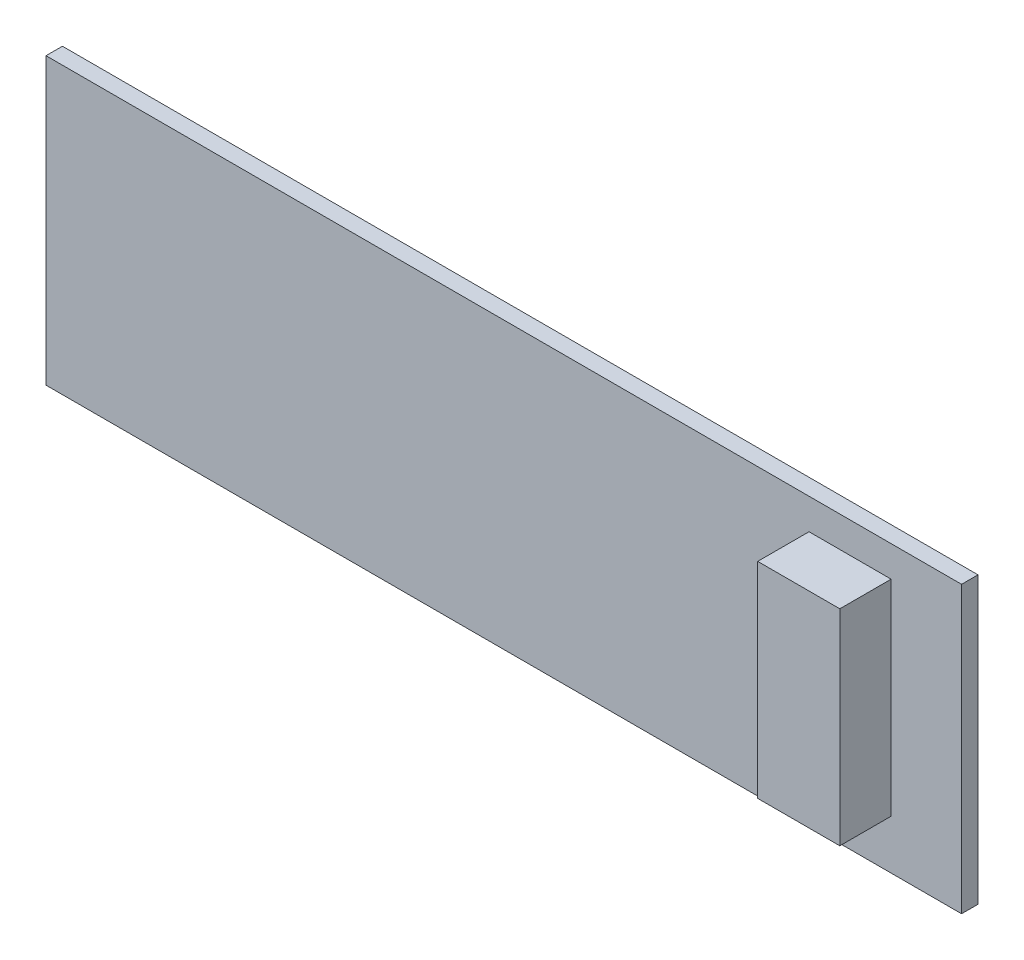
ISO-10303-21;
HEADER;
FILE_DESCRIPTION(('STEP AP214'),'2;1');
FILE_NAME('part.step','',(''),(''),'','','');
FILE_SCHEMA(('AUTOMOTIVE_DESIGN { 1 0 10303 214 1 1 1 1 }'));
ENDSEC;
DATA;
#1=APPLICATION_CONTEXT('core data for automotive mechanical design processes');
#2=APPLICATION_PROTOCOL_DEFINITION('international standard','automotive_design',2000,#1);
#3=PRODUCT_CONTEXT('',#1,'mechanical');
#4=PRODUCT('Part','Part','',(#3));
#5=PRODUCT_RELATED_PRODUCT_CATEGORY('part','',(#4));
#6=PRODUCT_DEFINITION_FORMATION('','',#4);
#7=PRODUCT_DEFINITION_CONTEXT('part definition',#1,'design');
#8=PRODUCT_DEFINITION('design','',#6,#7);
#9=PRODUCT_DEFINITION_SHAPE('','',#8);
#10=(LENGTH_UNIT() NAMED_UNIT(*) SI_UNIT(.MILLI.,.METRE.));
#11=(NAMED_UNIT(*) PLANE_ANGLE_UNIT() SI_UNIT($,.RADIAN.));
#12=(NAMED_UNIT(*) SI_UNIT($,.STERADIAN.) SOLID_ANGLE_UNIT());
#13=UNCERTAINTY_MEASURE_WITH_UNIT(LENGTH_MEASURE(1.E-05),#10,'distance_accuracy_value','');
#14=(GEOMETRIC_REPRESENTATION_CONTEXT(3) GLOBAL_UNCERTAINTY_ASSIGNED_CONTEXT((#13)) GLOBAL_UNIT_ASSIGNED_CONTEXT((#10,
#11,#12)) REPRESENTATION_CONTEXT('',''));
#15=CARTESIAN_POINT('',(0.,0.,0.));
#16=DIRECTION('',(0.,0.,1.));
#17=DIRECTION('',(1.,0.,0.));
#18=AXIS2_PLACEMENT_3D('',#15,#16,#17);
#19=CARTESIAN_POINT('',(0.,0.,0.));
#20=DIRECTION('',(0.,0.,1.));
#21=DIRECTION('',(1.,0.,0.));
#22=AXIS2_PLACEMENT_3D('',#19,#20,#21);
#23=PLANE('',#22);
#24=DIRECTION('',(0.,-1.,0.));
#25=VECTOR('',#24,1.);
#26=CARTESIAN_POINT('',(-44.6,13.9,0.));
#27=LINE('',#26,#25);
#28=CARTESIAN_POINT('',(-44.6,13.9,0.));
#29=VERTEX_POINT('',#28);
#30=CARTESIAN_POINT('',(-44.6,-13.9,0.));
#31=VERTEX_POINT('',#30);
#32=EDGE_CURVE('E133',#29,#31,#27,.T.);
#33=ORIENTED_EDGE('',*,*,#32,.T.);
#34=DIRECTION('',(1.,0.,0.));
#35=VECTOR('',#34,1.);
#36=CARTESIAN_POINT('',(-44.6,-13.9,0.));
#37=LINE('',#36,#35);
#38=CARTESIAN_POINT('',(44.6,-13.9,0.));
#39=VERTEX_POINT('',#38);
#40=EDGE_CURVE('E136',#31,#39,#37,.T.);
#41=ORIENTED_EDGE('',*,*,#40,.T.);
#42=DIRECTION('',(0.,1.,0.));
#43=VECTOR('',#42,1.);
#44=CARTESIAN_POINT('',(44.6,-13.9,0.));
#45=LINE('',#44,#43);
#46=CARTESIAN_POINT('',(44.6,13.9,0.));
#47=VERTEX_POINT('',#46);
#48=EDGE_CURVE('E153',#39,#47,#45,.T.);
#49=ORIENTED_EDGE('',*,*,#48,.T.);
#50=DIRECTION('',(-1.,0.,0.));
#51=VECTOR('',#50,1.);
#52=CARTESIAN_POINT('',(44.6,13.9,0.));
#53=LINE('',#52,#51);
#54=EDGE_CURVE('E144',#47,#29,#53,.T.);
#55=ORIENTED_EDGE('',*,*,#54,.T.);
#56=EDGE_LOOP('',(#33,#41,#49,#55));
#57=FACE_BOUND('',#56,.T.);
#58=DIRECTION('',(-1.,0.,0.));
#59=VECTOR('',#58,1.);
#60=CARTESIAN_POINT('',(29.7376156955747,10.9031580087813,0.));
#61=LINE('',#60,#59);
#62=CARTESIAN_POINT('',(37.7376156955747,10.9031580087813,0.));
#63=VERTEX_POINT('',#62);
#64=CARTESIAN_POINT('',(29.7376156955747,10.9031580087813,0.));
#65=VERTEX_POINT('',#64);
#66=EDGE_CURVE('E265',#63,#65,#61,.T.);
#67=ORIENTED_EDGE('',*,*,#66,.F.);
#68=DIRECTION('',(0.,1.,0.));
#69=VECTOR('',#68,1.);
#70=CARTESIAN_POINT('',(37.7376156955747,10.9031580087813,0.));
#71=LINE('',#70,#69);
#72=CARTESIAN_POINT('',(37.7376156955747,-9.09684199121867,0.));
#73=VERTEX_POINT('',#72);
#74=EDGE_CURVE('E131',#73,#63,#71,.T.);
#75=ORIENTED_EDGE('',*,*,#74,.F.);
#76=DIRECTION('',(1.,0.,0.));
#77=VECTOR('',#76,1.);
#78=CARTESIAN_POINT('',(37.7376156955747,-9.09684199121867,0.));
#79=LINE('',#78,#77);
#80=CARTESIAN_POINT('',(29.7376156955747,-9.09684199121867,0.));
#81=VERTEX_POINT('',#80);
#82=EDGE_CURVE('E127',#81,#73,#79,.T.);
#83=ORIENTED_EDGE('',*,*,#82,.F.);
#84=DIRECTION('',(0.,-1.,0.));
#85=VECTOR('',#84,1.);
#86=CARTESIAN_POINT('',(29.7376156955747,-9.09684199121867,0.));
#87=LINE('',#86,#85);
#88=EDGE_CURVE('E262',#65,#81,#87,.T.);
#89=ORIENTED_EDGE('',*,*,#88,.F.);
#90=EDGE_LOOP('',(#67,#75,#83,#89));
#91=FACE_BOUND('',#90,.T.);
#92=ADVANCED_FACE('F35',(#57,#91),#23,.T.);
#93=CARTESIAN_POINT('',(-44.6,13.9,-1.6));
#94=DIRECTION('',(-1.,0.,0.));
#95=DIRECTION('',(0.,0.,1.));
#96=AXIS2_PLACEMENT_3D('',#93,#94,#95);
#97=PLANE('',#96);
#98=ORIENTED_EDGE('',*,*,#32,.F.);
#99=DIRECTION('',(0.,0.,1.));
#100=VECTOR('',#99,1.);
#101=CARTESIAN_POINT('',(-44.6,13.9,-1.6));
#102=LINE('',#101,#100);
#103=CARTESIAN_POINT('',(-44.6,13.9,-1.6));
#104=VERTEX_POINT('',#103);
#105=EDGE_CURVE('E11',#104,#29,#102,.T.);
#106=ORIENTED_EDGE('',*,*,#105,.F.);
#107=DIRECTION('',(0.,-1.,0.));
#108=VECTOR('',#107,1.);
#109=CARTESIAN_POINT('',(-44.6,13.9,-1.6));
#110=LINE('',#109,#108);
#111=CARTESIAN_POINT('',(-44.6,-13.9,-1.6));
#112=VERTEX_POINT('',#111);
#113=EDGE_CURVE('E141',#104,#112,#110,.T.);
#114=ORIENTED_EDGE('',*,*,#113,.T.);
#115=DIRECTION('',(0.,0.,1.));
#116=VECTOR('',#115,1.);
#117=CARTESIAN_POINT('',(-44.6,-13.9,-1.6));
#118=LINE('',#117,#116);
#119=EDGE_CURVE('E39',#112,#31,#118,.T.);
#120=ORIENTED_EDGE('',*,*,#119,.T.);
#121=EDGE_LOOP('',(#98,#106,#114,#120));
#122=FACE_BOUND('',#121,.T.);
#123=ADVANCED_FACE('F37',(#122),#97,.T.);
#124=CARTESIAN_POINT('',(44.6,13.9,-1.6));
#125=DIRECTION('',(0.,1.,0.));
#126=DIRECTION('',(0.,0.,1.));
#127=AXIS2_PLACEMENT_3D('',#124,#125,#126);
#128=PLANE('',#127);
#129=ORIENTED_EDGE('',*,*,#54,.F.);
#130=DIRECTION('',(0.,0.,1.));
#131=VECTOR('',#130,1.);
#132=CARTESIAN_POINT('',(44.6,13.9,-1.6));
#133=LINE('',#132,#131);
#134=CARTESIAN_POINT('',(44.6,13.9,-1.6));
#135=VERTEX_POINT('',#134);
#136=EDGE_CURVE('E44',#135,#47,#133,.T.);
#137=ORIENTED_EDGE('',*,*,#136,.F.);
#138=DIRECTION('',(-1.,0.,0.));
#139=VECTOR('',#138,1.);
#140=CARTESIAN_POINT('',(44.6,13.9,-1.6));
#141=LINE('',#140,#139);
#142=EDGE_CURVE('E149',#135,#104,#141,.T.);
#143=ORIENTED_EDGE('',*,*,#142,.T.);
#144=ORIENTED_EDGE('',*,*,#105,.T.);
#145=EDGE_LOOP('',(#129,#137,#143,#144));
#146=FACE_BOUND('',#145,.T.);
#147=ADVANCED_FACE('F163',(#146),#128,.T.);
#148=CARTESIAN_POINT('',(44.6,-13.9,-1.6));
#149=DIRECTION('',(1.,0.,0.));
#150=DIRECTION('',(0.,0.,-1.));
#151=AXIS2_PLACEMENT_3D('',#148,#149,#150);
#152=PLANE('',#151);
#153=ORIENTED_EDGE('',*,*,#48,.F.);
#154=DIRECTION('',(0.,0.,1.));
#155=VECTOR('',#154,1.);
#156=CARTESIAN_POINT('',(44.6,-13.9,-1.6));
#157=LINE('',#156,#155);
#158=CARTESIAN_POINT('',(44.6,-13.9,-1.6));
#159=VERTEX_POINT('',#158);
#160=EDGE_CURVE('E158',#159,#39,#157,.T.);
#161=ORIENTED_EDGE('',*,*,#160,.F.);
#162=DIRECTION('',(0.,1.,0.));
#163=VECTOR('',#162,1.);
#164=CARTESIAN_POINT('',(44.6,-13.9,-1.6));
#165=LINE('',#164,#163);
#166=EDGE_CURVE('E146',#159,#135,#165,.T.);
#167=ORIENTED_EDGE('',*,*,#166,.T.);
#168=ORIENTED_EDGE('',*,*,#136,.T.);
#169=EDGE_LOOP('',(#153,#161,#167,#168));
#170=FACE_BOUND('',#169,.T.);
#171=ADVANCED_FACE('F167',(#170),#152,.T.);
#172=CARTESIAN_POINT('',(-44.6,-13.9,-1.6));
#173=DIRECTION('',(0.,-1.,0.));
#174=DIRECTION('',(0.,0.,-1.));
#175=AXIS2_PLACEMENT_3D('',#172,#173,#174);
#176=PLANE('',#175);
#177=ORIENTED_EDGE('',*,*,#40,.F.);
#178=ORIENTED_EDGE('',*,*,#119,.F.);
#179=DIRECTION('',(1.,0.,0.));
#180=VECTOR('',#179,1.);
#181=CARTESIAN_POINT('',(-44.6,-13.9,-1.6));
#182=LINE('',#181,#180);
#183=EDGE_CURVE('E143',#112,#159,#182,.T.);
#184=ORIENTED_EDGE('',*,*,#183,.T.);
#185=ORIENTED_EDGE('',*,*,#160,.T.);
#186=EDGE_LOOP('',(#177,#178,#184,#185));
#187=FACE_BOUND('',#186,.T.);
#188=ADVANCED_FACE('F160',(#187),#176,.T.);
#189=CARTESIAN_POINT('',(0.,0.,-1.6));
#190=DIRECTION('',(0.,0.,1.));
#191=DIRECTION('',(1.,0.,0.));
#192=AXIS2_PLACEMENT_3D('',#189,#190,#191);
#193=PLANE('',#192);
#194=ORIENTED_EDGE('',*,*,#113,.F.);
#195=ORIENTED_EDGE('',*,*,#142,.F.);
#196=ORIENTED_EDGE('',*,*,#166,.F.);
#197=ORIENTED_EDGE('',*,*,#183,.F.);
#198=EDGE_LOOP('',(#194,#195,#196,#197));
#199=FACE_BOUND('',#198,.T.);
#200=ADVANCED_FACE('F169',(#199),#193,.F.);
#201=CARTESIAN_POINT('',(37.7376156955747,10.9031580087813,5.));
#202=DIRECTION('',(-1.,0.,0.));
#203=DIRECTION('',(0.,0.,1.));
#204=AXIS2_PLACEMENT_3D('',#201,#202,#203);
#205=PLANE('',#204);
#206=ORIENTED_EDGE('',*,*,#74,.T.);
#207=DIRECTION('',(0.,0.,-1.));
#208=VECTOR('',#207,1.);
#209=CARTESIAN_POINT('',(37.7376156955747,10.9031580087813,5.));
#210=LINE('',#209,#208);
#211=CARTESIAN_POINT('',(37.7376156955747,10.9031580087813,5.));
#212=VERTEX_POINT('',#211);
#213=EDGE_CURVE('E112',#212,#63,#210,.T.);
#214=ORIENTED_EDGE('',*,*,#213,.F.);
#215=DIRECTION('',(0.,1.,0.));
#216=VECTOR('',#215,1.);
#217=CARTESIAN_POINT('',(37.7376156955747,10.9031580087813,5.));
#218=LINE('',#217,#216);
#219=CARTESIAN_POINT('',(37.7376156955747,-9.09684199121867,5.));
#220=VERTEX_POINT('',#219);
#221=EDGE_CURVE('E119',#220,#212,#218,.T.);
#222=ORIENTED_EDGE('',*,*,#221,.F.);
#223=DIRECTION('',(0.,0.,-1.));
#224=VECTOR('',#223,1.);
#225=CARTESIAN_POINT('',(37.7376156955747,-9.09684199121867,5.));
#226=LINE('',#225,#224);
#227=EDGE_CURVE('E260',#220,#73,#226,.T.);
#228=ORIENTED_EDGE('',*,*,#227,.T.);
#229=EDGE_LOOP('',(#206,#214,#222,#228));
#230=FACE_BOUND('',#229,.T.);
#231=ADVANCED_FACE('F129',(#230),#205,.F.);
#232=CARTESIAN_POINT('',(29.7376156955747,10.9031580087813,5.));
#233=DIRECTION('',(0.,-1.,0.));
#234=DIRECTION('',(1.,0.,0.));
#235=AXIS2_PLACEMENT_3D('',#232,#233,#234);
#236=PLANE('',#235);
#237=ORIENTED_EDGE('',*,*,#66,.T.);
#238=DIRECTION('',(0.,0.,-1.));
#239=VECTOR('',#238,1.);
#240=CARTESIAN_POINT('',(29.7376156955747,10.9031580087813,5.));
#241=LINE('',#240,#239);
#242=CARTESIAN_POINT('',(29.7376156955747,10.9031580087813,5.));
#243=VERTEX_POINT('',#242);
#244=EDGE_CURVE('E115',#243,#65,#241,.T.);
#245=ORIENTED_EDGE('',*,*,#244,.F.);
#246=DIRECTION('',(-1.,0.,0.));
#247=VECTOR('',#246,1.);
#248=CARTESIAN_POINT('',(29.7376156955747,10.9031580087813,5.));
#249=LINE('',#248,#247);
#250=EDGE_CURVE('E108',#212,#243,#249,.T.);
#251=ORIENTED_EDGE('',*,*,#250,.F.);
#252=ORIENTED_EDGE('',*,*,#213,.T.);
#253=EDGE_LOOP('',(#237,#245,#251,#252));
#254=FACE_BOUND('',#253,.T.);
#255=ADVANCED_FACE('F110',(#254),#236,.F.);
#256=CARTESIAN_POINT('',(29.7376156955747,-9.09684199121867,5.));
#257=DIRECTION('',(1.,0.,0.));
#258=DIRECTION('',(0.,0.,-1.));
#259=AXIS2_PLACEMENT_3D('',#256,#257,#258);
#260=PLANE('',#259);
#261=ORIENTED_EDGE('',*,*,#88,.T.);
#262=DIRECTION('',(0.,0.,-1.));
#263=VECTOR('',#262,1.);
#264=CARTESIAN_POINT('',(29.7376156955747,-9.09684199121867,5.));
#265=LINE('',#264,#263);
#266=CARTESIAN_POINT('',(29.7376156955747,-9.09684199121867,5.));
#267=VERTEX_POINT('',#266);
#268=EDGE_CURVE('E52',#267,#81,#265,.T.);
#269=ORIENTED_EDGE('',*,*,#268,.F.);
#270=DIRECTION('',(0.,-1.,0.));
#271=VECTOR('',#270,1.);
#272=CARTESIAN_POINT('',(29.7376156955747,-9.09684199121867,5.));
#273=LINE('',#272,#271);
#274=EDGE_CURVE('E118',#243,#267,#273,.T.);
#275=ORIENTED_EDGE('',*,*,#274,.F.);
#276=ORIENTED_EDGE('',*,*,#244,.T.);
#277=EDGE_LOOP('',(#261,#269,#275,#276));
#278=FACE_BOUND('',#277,.T.);
#279=ADVANCED_FACE('F222',(#278),#260,.F.);
#280=CARTESIAN_POINT('',(37.7376156955747,-9.09684199121867,5.));
#281=DIRECTION('',(0.,1.,0.));
#282=DIRECTION('',(-1.,0.,0.));
#283=AXIS2_PLACEMENT_3D('',#280,#281,#282);
#284=PLANE('',#283);
#285=ORIENTED_EDGE('',*,*,#82,.T.);
#286=ORIENTED_EDGE('',*,*,#227,.F.);
#287=DIRECTION('',(1.,0.,0.));
#288=VECTOR('',#287,1.);
#289=CARTESIAN_POINT('',(37.7376156955747,-9.09684199121867,5.));
#290=LINE('',#289,#288);
#291=EDGE_CURVE('E123',#267,#220,#290,.T.);
#292=ORIENTED_EDGE('',*,*,#291,.F.);
#293=ORIENTED_EDGE('',*,*,#268,.T.);
#294=EDGE_LOOP('',(#285,#286,#292,#293));
#295=FACE_BOUND('',#294,.T.);
#296=ADVANCED_FACE('F233',(#295),#284,.F.);
#297=CARTESIAN_POINT('',(0.,0.,5.));
#298=DIRECTION('',(0.,0.,-1.));
#299=DIRECTION('',(-1.,0.,0.));
#300=AXIS2_PLACEMENT_3D('',#297,#298,#299);
#301=PLANE('',#300);
#302=ORIENTED_EDGE('',*,*,#221,.T.);
#303=ORIENTED_EDGE('',*,*,#250,.T.);
#304=ORIENTED_EDGE('',*,*,#274,.T.);
#305=ORIENTED_EDGE('',*,*,#291,.T.);
#306=EDGE_LOOP('',(#302,#303,#304,#305));
#307=FACE_BOUND('',#306,.T.);
#308=ADVANCED_FACE('F122',(#307),#301,.F.);
#309=CLOSED_SHELL('',(#92,#123,#147,#171,#188,#200,#231,#255,#279,#296,#308));
#310=MANIFOLD_SOLID_BREP('B2',#309);
#311=ADVANCED_BREP_SHAPE_REPRESENTATION('',(#18,#310),#14);
#312=SHAPE_DEFINITION_REPRESENTATION(#9,#311);
ENDSEC;
END-ISO-10303-21;
